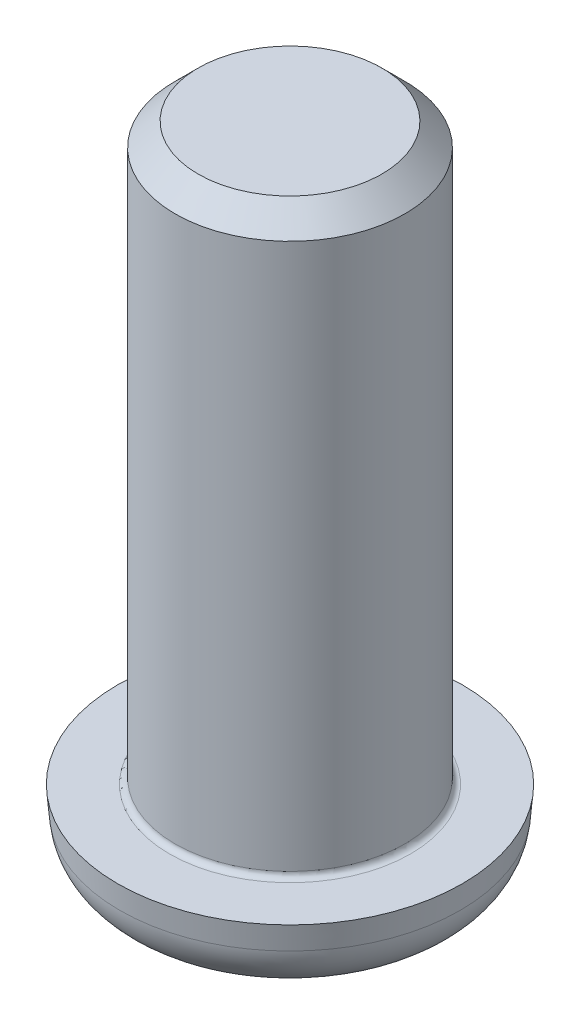
ISO-10303-21;
HEADER;
FILE_DESCRIPTION(('STEP AP214'),'2;1');
FILE_NAME('part.step','',(''),(''),'','','');
FILE_SCHEMA(('AUTOMOTIVE_DESIGN { 1 0 10303 214 1 1 1 1 }'));
ENDSEC;
DATA;
#1=APPLICATION_CONTEXT('core data for automotive mechanical design processes');
#2=APPLICATION_PROTOCOL_DEFINITION('international standard','automotive_design',2000,#1);
#3=PRODUCT_CONTEXT('',#1,'mechanical');
#4=PRODUCT('Part','Part','',(#3));
#5=PRODUCT_RELATED_PRODUCT_CATEGORY('part','',(#4));
#6=PRODUCT_DEFINITION_FORMATION('','',#4);
#7=PRODUCT_DEFINITION_CONTEXT('part definition',#1,'design');
#8=PRODUCT_DEFINITION('design','',#6,#7);
#9=PRODUCT_DEFINITION_SHAPE('','',#8);
#10=(LENGTH_UNIT() NAMED_UNIT(*) SI_UNIT(.MILLI.,.METRE.));
#11=(NAMED_UNIT(*) PLANE_ANGLE_UNIT() SI_UNIT($,.RADIAN.));
#12=(NAMED_UNIT(*) SI_UNIT($,.STERADIAN.) SOLID_ANGLE_UNIT());
#13=UNCERTAINTY_MEASURE_WITH_UNIT(LENGTH_MEASURE(1.E-05),#10,'distance_accuracy_value','');
#14=(GEOMETRIC_REPRESENTATION_CONTEXT(3) GLOBAL_UNCERTAINTY_ASSIGNED_CONTEXT((#13)) GLOBAL_UNIT_ASSIGNED_CONTEXT((#10,
#11,#12)) REPRESENTATION_CONTEXT('',''));
#15=CARTESIAN_POINT('',(0.,0.,0.));
#16=DIRECTION('',(0.,0.,1.));
#17=DIRECTION('',(1.,0.,0.));
#18=AXIS2_PLACEMENT_3D('',#15,#16,#17);
#19=CARTESIAN_POINT('',(0.,0.,1.));
#20=DIRECTION('',(0.,1.,0.));
#21=DIRECTION('',(0.,0.,1.));
#22=AXIS2_PLACEMENT_3D('',#19,#20,#21);
#23=PLANE('',#22);
#24=CARTESIAN_POINT('',(0.,0.,0.));
#25=DIRECTION('',(0.,1.,0.));
#26=DIRECTION('',(0.,0.,1.));
#27=AXIS2_PLACEMENT_3D('',#24,#25,#26);
#28=CIRCLE('',#27,1.05);
#29=CARTESIAN_POINT('',(0.,0.,1.05));
#30=VERTEX_POINT('',#29);
#31=EDGE_CURVE('E286',#30,#30,#28,.F.);
#32=ORIENTED_EDGE('',*,*,#31,.T.);
#33=EDGE_LOOP('',(#32));
#34=FACE_BOUND('',#33,.T.);
#35=CARTESIAN_POINT('',(0.,0.,0.));
#36=DIRECTION('',(0.,1.,0.));
#37=DIRECTION('',(0.,0.,1.));
#38=AXIS2_PLACEMENT_3D('',#35,#36,#37);
#39=CIRCLE('',#38,1.5);
#40=CARTESIAN_POINT('',(0.,0.,1.5));
#41=VERTEX_POINT('',#40);
#42=EDGE_CURVE('E270',#41,#41,#39,.T.);
#43=ORIENTED_EDGE('',*,*,#42,.T.);
#44=EDGE_LOOP('',(#43));
#45=FACE_BOUND('',#44,.T.);
#46=ADVANCED_FACE('F36',(#34,#45),#23,.T.);
#47=CARTESIAN_POINT('',(0.,0.,0.));
#48=DIRECTION('',(0.,1.,0.));
#49=DIRECTION('',(0.,0.,1.));
#50=AXIS2_PLACEMENT_3D('',#47,#48,#49);
#51=CONICAL_SURFACE('',#50,1.5,0.087266462599715);
#52=CARTESIAN_POINT('',(0.,-0.21,0.));
#53=DIRECTION('',(0.,1.,0.));
#54=DIRECTION('',(0.,0.,1.));
#55=AXIS2_PLACEMENT_3D('',#52,#53,#54);
#56=CIRCLE('',#55,1.48162738065956);
#57=CARTESIAN_POINT('',(0.,-0.21,1.48162738065956));
#58=VERTEX_POINT('',#57);
#59=EDGE_CURVE('E196',#58,#58,#56,.T.);
#60=ORIENTED_EDGE('',*,*,#59,.T.);
#61=EDGE_LOOP('',(#60));
#62=FACE_BOUND('',#61,.T.);
#63=ORIENTED_EDGE('',*,*,#42,.F.);
#64=EDGE_LOOP('',(#63));
#65=FACE_BOUND('',#64,.T.);
#66=ADVANCED_FACE('F305',(#62,#65),#51,.T.);
#67=CARTESIAN_POINT('',(0.,-0.169099911978679,0.));
#68=DIRECTION('',(0.,1.,0.));
#69=DIRECTION('',(0.,0.,1.));
#70=AXIS2_PLACEMENT_3D('',#67,#68,#69);
#71=TOROIDAL_SURFACE('',#70,1.01413723538831,0.469275881679299);
#72=CARTESIAN_POINT('',(0.,-0.571497043538653,0.));
#73=DIRECTION('',(0.,1.,0.));
#74=DIRECTION('',(0.,0.,1.));
#75=AXIS2_PLACEMENT_3D('',#72,#73,#74);
#76=CIRCLE('',#75,1.25558371318036);
#77=CARTESIAN_POINT('',(0.,-0.571497043538653,1.25558371318036));
#78=VERTEX_POINT('',#77);
#79=EDGE_CURVE('E274',#78,#78,#76,.T.);
#80=ORIENTED_EDGE('',*,*,#79,.T.);
#81=EDGE_LOOP('',(#80));
#82=FACE_BOUND('',#81,.T.);
#83=ORIENTED_EDGE('',*,*,#59,.F.);
#84=EDGE_LOOP('',(#83));
#85=FACE_BOUND('',#84,.T.);
#86=ADVANCED_FACE('F311',(#82,#85),#71,.T.);
#87=CARTESIAN_POINT('',(0.,-0.6,0.));
#88=DIRECTION('',(0.,-1.,0.));
#89=DIRECTION('',(0.,0.,-1.));
#90=AXIS2_PLACEMENT_3D('',#87,#88,#89);
#91=PLANE('',#90);
#92=DIRECTION('',(0.,0.,-1.));
#93=VECTOR('',#92,1.);
#94=CARTESIAN_POINT('',(-0.15725,-0.6,0.925));
#95=LINE('',#94,#93);
#96=CARTESIAN_POINT('',(-0.15725,-0.6,0.925));
#97=VERTEX_POINT('',#96);
#98=CARTESIAN_POINT('',(-0.15725,-0.6,0.15725));
#99=VERTEX_POINT('',#98);
#100=EDGE_CURVE('E52',#97,#99,#95,.T.);
#101=ORIENTED_EDGE('',*,*,#100,.F.);
#102=DIRECTION('',(-1.,0.,0.));
#103=VECTOR('',#102,1.);
#104=CARTESIAN_POINT('',(-0.15725,-0.6,0.925));
#105=LINE('',#104,#103);
#106=CARTESIAN_POINT('',(0.15725,-0.6,0.925));
#107=VERTEX_POINT('',#106);
#108=EDGE_CURVE('E190',#107,#97,#105,.T.);
#109=ORIENTED_EDGE('',*,*,#108,.F.);
#110=DIRECTION('',(0.,0.,1.));
#111=VECTOR('',#110,1.);
#112=CARTESIAN_POINT('',(0.15725,-0.6,0.925));
#113=LINE('',#112,#111);
#114=CARTESIAN_POINT('',(0.157250000000001,-0.6,0.15725));
#115=VERTEX_POINT('',#114);
#116=EDGE_CURVE('E187',#115,#107,#113,.T.);
#117=ORIENTED_EDGE('',*,*,#116,.F.);
#118=DIRECTION('',(-1.,0.,0.));
#119=VECTOR('',#118,1.);
#120=CARTESIAN_POINT('',(0.157250000000001,-0.6,0.15725));
#121=LINE('',#120,#119);
#122=CARTESIAN_POINT('',(0.925,-0.6,0.15725));
#123=VERTEX_POINT('',#122);
#124=EDGE_CURVE('E183',#123,#115,#121,.T.);
#125=ORIENTED_EDGE('',*,*,#124,.F.);
#126=DIRECTION('',(0.,0.,1.));
#127=VECTOR('',#126,1.);
#128=CARTESIAN_POINT('',(0.925,-0.6,0.15725));
#129=LINE('',#128,#127);
#130=CARTESIAN_POINT('',(0.925,-0.6,-0.15725));
#131=VERTEX_POINT('',#130);
#132=EDGE_CURVE('E179',#131,#123,#129,.T.);
#133=ORIENTED_EDGE('',*,*,#132,.F.);
#134=DIRECTION('',(1.,0.,0.));
#135=VECTOR('',#134,1.);
#136=CARTESIAN_POINT('',(0.157250000000001,-0.6,-0.15725));
#137=LINE('',#136,#135);
#138=CARTESIAN_POINT('',(0.157250000000001,-0.6,-0.15725));
#139=VERTEX_POINT('',#138);
#140=EDGE_CURVE('E175',#139,#131,#137,.T.);
#141=ORIENTED_EDGE('',*,*,#140,.F.);
#142=DIRECTION('',(0.,0.,1.));
#143=VECTOR('',#142,1.);
#144=CARTESIAN_POINT('',(0.157250000000001,-0.6,-0.15725));
#145=LINE('',#144,#143);
#146=CARTESIAN_POINT('',(0.157250000000001,-0.6,-0.925));
#147=VERTEX_POINT('',#146);
#148=EDGE_CURVE('E171',#147,#139,#145,.T.);
#149=ORIENTED_EDGE('',*,*,#148,.F.);
#150=DIRECTION('',(1.,0.,0.));
#151=VECTOR('',#150,1.);
#152=CARTESIAN_POINT('',(-0.15725,-0.6,-0.925));
#153=LINE('',#152,#151);
#154=CARTESIAN_POINT('',(-0.15725,-0.6,-0.925));
#155=VERTEX_POINT('',#154);
#156=EDGE_CURVE('E167',#155,#147,#153,.T.);
#157=ORIENTED_EDGE('',*,*,#156,.F.);
#158=DIRECTION('',(0.,0.,-1.));
#159=VECTOR('',#158,1.);
#160=CARTESIAN_POINT('',(-0.15725,-0.6,-0.15725));
#161=LINE('',#160,#159);
#162=CARTESIAN_POINT('',(-0.15725,-0.6,-0.15725));
#163=VERTEX_POINT('',#162);
#164=EDGE_CURVE('E160',#163,#155,#161,.T.);
#165=ORIENTED_EDGE('',*,*,#164,.F.);
#166=DIRECTION('',(1.,0.,0.));
#167=VECTOR('',#166,1.);
#168=CARTESIAN_POINT('',(-0.925,-0.6,-0.15725));
#169=LINE('',#168,#167);
#170=CARTESIAN_POINT('',(-0.925,-0.6,-0.15725));
#171=VERTEX_POINT('',#170);
#172=EDGE_CURVE('E154',#171,#163,#169,.T.);
#173=ORIENTED_EDGE('',*,*,#172,.F.);
#174=DIRECTION('',(0.,0.,-1.));
#175=VECTOR('',#174,1.);
#176=CARTESIAN_POINT('',(-0.925,-0.6,0.15725));
#177=LINE('',#176,#175);
#178=CARTESIAN_POINT('',(-0.925,-0.6,0.15725));
#179=VERTEX_POINT('',#178);
#180=EDGE_CURVE('E135',#179,#171,#177,.T.);
#181=ORIENTED_EDGE('',*,*,#180,.F.);
#182=DIRECTION('',(-1.,0.,0.));
#183=VECTOR('',#182,1.);
#184=CARTESIAN_POINT('',(-0.925,-0.6,0.15725));
#185=LINE('',#184,#183);
#186=EDGE_CURVE('E145',#99,#179,#185,.T.);
#187=ORIENTED_EDGE('',*,*,#186,.F.);
#188=EDGE_LOOP('',(#101,#109,#117,#125,#133,#141,#149,#157,#165,#173,#181,#187));
#189=FACE_BOUND('',#188,.T.);
#190=CARTESIAN_POINT('',(0.,-0.6,0.));
#191=DIRECTION('',(0.,-1.,0.));
#192=DIRECTION('',(0.,0.,-1.));
#193=AXIS2_PLACEMENT_3D('',#190,#191,#192);
#194=CIRCLE('',#193,1.15268199279872);
#195=CARTESIAN_POINT('',(0.,-0.6,-1.15268199279872));
#196=VERTEX_POINT('',#195);
#197=EDGE_CURVE('E278',#196,#196,#194,.T.);
#198=ORIENTED_EDGE('',*,*,#197,.T.);
#199=EDGE_LOOP('',(#198));
#200=FACE_BOUND('',#199,.T.);
#201=ADVANCED_FACE('F150',(#189,#200),#91,.T.);
#202=CARTESIAN_POINT('',(0.,5.,1.));
#203=DIRECTION('',(0.,1.,0.));
#204=DIRECTION('',(0.,0.,1.));
#205=AXIS2_PLACEMENT_3D('',#202,#203,#204);
#206=PLANE('',#205);
#207=CARTESIAN_POINT('',(0.,5.,0.));
#208=DIRECTION('',(0.,1.,0.));
#209=DIRECTION('',(0.,0.,1.));
#210=AXIS2_PLACEMENT_3D('',#207,#208,#209);
#211=CIRCLE('',#210,0.8);
#212=CARTESIAN_POINT('',(0.,5.,0.8));
#213=VERTEX_POINT('',#212);
#214=EDGE_CURVE('E45',#213,#213,#211,.T.);
#215=ORIENTED_EDGE('',*,*,#214,.T.);
#216=EDGE_LOOP('',(#215));
#217=FACE_BOUND('',#216,.T.);
#218=ADVANCED_FACE('F293',(#217),#206,.T.);
#219=CARTESIAN_POINT('',(0.,5.,0.));
#220=DIRECTION('',(0.,1.,0.));
#221=DIRECTION('',(0.,0.,1.));
#222=AXIS2_PLACEMENT_3D('',#219,#220,#221);
#223=CYLINDRICAL_SURFACE('',#222,1.);
#224=CARTESIAN_POINT('',(0.,4.8,0.));
#225=DIRECTION('',(0.,1.,0.));
#226=DIRECTION('',(0.,0.,1.));
#227=AXIS2_PLACEMENT_3D('',#224,#225,#226);
#228=CIRCLE('',#227,1.);
#229=CARTESIAN_POINT('',(0.,4.8,1.));
#230=VERTEX_POINT('',#229);
#231=EDGE_CURVE('E11',#230,#230,#228,.F.);
#232=ORIENTED_EDGE('',*,*,#231,.T.);
#233=EDGE_LOOP('',(#232));
#234=FACE_BOUND('',#233,.T.);
#235=CARTESIAN_POINT('',(0.,0.0499999999999997,0.));
#236=DIRECTION('',(0.,1.,0.));
#237=DIRECTION('',(0.,0.,1.));
#238=AXIS2_PLACEMENT_3D('',#235,#236,#237);
#239=CIRCLE('',#238,1.);
#240=CARTESIAN_POINT('',(0.,0.0499999999999996,1.));
#241=VERTEX_POINT('',#240);
#242=EDGE_CURVE('E282',#241,#241,#239,.T.);
#243=ORIENTED_EDGE('',*,*,#242,.T.);
#244=EDGE_LOOP('',(#243));
#245=FACE_BOUND('',#244,.T.);
#246=ADVANCED_FACE('F320',(#234,#245),#223,.T.);
#247=CARTESIAN_POINT('',(0.,-0.4,0.));
#248=DIRECTION('',(0.,-1.,0.));
#249=DIRECTION('',(0.,0.,-1.));
#250=AXIS2_PLACEMENT_3D('',#247,#248,#249);
#251=TOROIDAL_SURFACE('',#250,1.15268199279872,0.2);
#252=ORIENTED_EDGE('',*,*,#197,.F.);
#253=EDGE_LOOP('',(#252));
#254=FACE_BOUND('',#253,.T.);
#255=ORIENTED_EDGE('',*,*,#79,.F.);
#256=EDGE_LOOP('',(#255));
#257=FACE_BOUND('',#256,.T.);
#258=ADVANCED_FACE('F317',(#254,#257),#251,.T.);
#259=CARTESIAN_POINT('',(-0.15725,-0.6,0.925));
#260=DIRECTION('',(-0.998629534754574,0.0523359562429439,0.));
#261=DIRECTION('',(-0.052335956242944,-0.998629534754574,0.));
#262=AXIS2_PLACEMENT_3D('',#259,#260,#261);
#263=PLANE('',#262);
#264=ORIENTED_EDGE('',*,*,#100,.T.);
#265=DIRECTION('',(-0.052264427688714,-0.997264688634237,0.0522644276887139));
#266=VECTOR('',#265,1.);
#267=CARTESIAN_POINT('',(-0.159347163175851,-0.640016257214874,0.15934716317585));
#268=LINE('',#267,#266);
#269=CARTESIAN_POINT('',(-0.090692120310538,0.67,0.0906921203105376));
#270=VERTEX_POINT('',#269);
#271=EDGE_CURVE('E95',#270,#99,#268,.T.);
#272=ORIENTED_EDGE('',*,*,#271,.F.);
#273=DIRECTION('',(0.,0.,-1.));
#274=VECTOR('',#273,1.);
#275=CARTESIAN_POINT('',(-0.090692120310538,0.67,-0.15725));
#276=LINE('',#275,#274);
#277=CARTESIAN_POINT('',(-0.0906921203105379,0.67,0.858442120310538));
#278=VERTEX_POINT('',#277);
#279=EDGE_CURVE('E193',#278,#270,#276,.T.);
#280=ORIENTED_EDGE('',*,*,#279,.F.);
#281=DIRECTION('',(-0.052264427688714,-0.997264688634237,0.0522644276887139));
#282=VECTOR('',#281,1.);
#283=CARTESIAN_POINT('',(-0.15725,-0.6,0.925));
#284=LINE('',#283,#282);
#285=EDGE_CURVE('E60',#278,#97,#284,.T.);
#286=ORIENTED_EDGE('',*,*,#285,.T.);
#287=EDGE_LOOP('',(#264,#272,#280,#286));
#288=FACE_BOUND('',#287,.T.);
#289=ADVANCED_FACE('F319',(#288),#263,.F.);
#290=CARTESIAN_POINT('',(-0.15725,-0.6,0.925));
#291=DIRECTION('',(0.,0.0523359562429438,0.998629534754574));
#292=DIRECTION('',(0.,-0.998629534754574,0.0523359562429438));
#293=AXIS2_PLACEMENT_3D('',#290,#291,#292);
#294=PLANE('',#293);
#295=ORIENTED_EDGE('',*,*,#108,.T.);
#296=ORIENTED_EDGE('',*,*,#285,.F.);
#297=DIRECTION('',(-1.,0.,0.));
#298=VECTOR('',#297,1.);
#299=CARTESIAN_POINT('',(-0.15725,0.67,0.858442120310538));
#300=LINE('',#299,#298);
#301=CARTESIAN_POINT('',(0.0906921203105374,0.67,0.858442120310538));
#302=VERTEX_POINT('',#301);
#303=EDGE_CURVE('E198',#302,#278,#300,.T.);
#304=ORIENTED_EDGE('',*,*,#303,.F.);
#305=DIRECTION('',(0.052264427688714,-0.997264688634237,0.0522644276887139));
#306=VECTOR('',#305,1.);
#307=CARTESIAN_POINT('',(0.15725,-0.6,0.925));
#308=LINE('',#307,#306);
#309=EDGE_CURVE('E100',#302,#107,#308,.T.);
#310=ORIENTED_EDGE('',*,*,#309,.T.);
#311=EDGE_LOOP('',(#295,#296,#304,#310));
#312=FACE_BOUND('',#311,.T.);
#313=ADVANCED_FACE('F326',(#312),#294,.F.);
#314=CARTESIAN_POINT('',(0.15725,-0.6,0.925));
#315=DIRECTION('',(0.998629534754574,0.0523359562429439,0.));
#316=DIRECTION('',(-0.052335956242944,0.998629534754574,0.));
#317=AXIS2_PLACEMENT_3D('',#314,#315,#316);
#318=PLANE('',#317);
#319=ORIENTED_EDGE('',*,*,#116,.T.);
#320=ORIENTED_EDGE('',*,*,#309,.F.);
#321=DIRECTION('',(0.,0.,1.));
#322=VECTOR('',#321,1.);
#323=CARTESIAN_POINT('',(0.090692120310539,0.67,-0.15725));
#324=LINE('',#323,#322);
#325=CARTESIAN_POINT('',(0.0906921203105386,0.67,0.0906921203105376));
#326=VERTEX_POINT('',#325);
#327=EDGE_CURVE('E232',#326,#302,#324,.T.);
#328=ORIENTED_EDGE('',*,*,#327,.F.);
#329=DIRECTION('',(0.052264427688714,-0.997264688634237,0.0522644276887139));
#330=VECTOR('',#329,1.);
#331=CARTESIAN_POINT('',(0.159347163175851,-0.640016257214874,0.15934716317585));
#332=LINE('',#331,#330);
#333=EDGE_CURVE('E220',#326,#115,#332,.T.);
#334=ORIENTED_EDGE('',*,*,#333,.T.);
#335=EDGE_LOOP('',(#319,#320,#328,#334));
#336=FACE_BOUND('',#335,.T.);
#337=ADVANCED_FACE('F348',(#336),#318,.F.);
#338=CARTESIAN_POINT('',(0.157250000000001,-0.6,0.15725));
#339=DIRECTION('',(0.,0.0523359562429438,0.998629534754574));
#340=DIRECTION('',(0.,-0.998629534754574,0.0523359562429438));
#341=AXIS2_PLACEMENT_3D('',#338,#339,#340);
#342=PLANE('',#341);
#343=ORIENTED_EDGE('',*,*,#124,.T.);
#344=ORIENTED_EDGE('',*,*,#333,.F.);
#345=DIRECTION('',(-1.,0.,0.));
#346=VECTOR('',#345,1.);
#347=CARTESIAN_POINT('',(-0.15725,0.67,0.0906921203105376));
#348=LINE('',#347,#346);
#349=CARTESIAN_POINT('',(0.858442120310538,0.67,0.0906921203105376));
#350=VERTEX_POINT('',#349);
#351=EDGE_CURVE('E236',#350,#326,#348,.T.);
#352=ORIENTED_EDGE('',*,*,#351,.F.);
#353=DIRECTION('',(0.052264427688714,-0.997264688634237,0.0522644276887139));
#354=VECTOR('',#353,1.);
#355=CARTESIAN_POINT('',(0.925,-0.6,0.15725));
#356=LINE('',#355,#354);
#357=EDGE_CURVE('E217',#350,#123,#356,.T.);
#358=ORIENTED_EDGE('',*,*,#357,.T.);
#359=EDGE_LOOP('',(#343,#344,#352,#358));
#360=FACE_BOUND('',#359,.T.);
#361=ADVANCED_FACE('F351',(#360),#342,.F.);
#362=CARTESIAN_POINT('',(0.925,-0.6,0.15725));
#363=DIRECTION('',(0.998629534754574,0.0523359562429439,0.));
#364=DIRECTION('',(-0.052335956242944,0.998629534754574,0.));
#365=AXIS2_PLACEMENT_3D('',#362,#363,#364);
#366=PLANE('',#365);
#367=ORIENTED_EDGE('',*,*,#132,.T.);
#368=ORIENTED_EDGE('',*,*,#357,.F.);
#369=DIRECTION('',(0.,0.,1.));
#370=VECTOR('',#369,1.);
#371=CARTESIAN_POINT('',(0.858442120310538,0.67,-0.15725));
#372=LINE('',#371,#370);
#373=CARTESIAN_POINT('',(0.858442120310538,0.67,-0.0906921203105375));
#374=VERTEX_POINT('',#373);
#375=EDGE_CURVE('E240',#374,#350,#372,.T.);
#376=ORIENTED_EDGE('',*,*,#375,.F.);
#377=DIRECTION('',(0.052264427688714,-0.997264688634237,-0.0522644276887142));
#378=VECTOR('',#377,1.);
#379=CARTESIAN_POINT('',(0.92290283682415,-0.559983742785126,-0.15515283682415));
#380=LINE('',#379,#378);
#381=EDGE_CURVE('E214',#374,#131,#380,.T.);
#382=ORIENTED_EDGE('',*,*,#381,.T.);
#383=EDGE_LOOP('',(#367,#368,#376,#382));
#384=FACE_BOUND('',#383,.T.);
#385=ADVANCED_FACE('F355',(#384),#366,.F.);
#386=CARTESIAN_POINT('',(0.157250000000001,-0.6,-0.15725));
#387=DIRECTION('',(0.,0.0523359562429441,-0.998629534754574));
#388=DIRECTION('',(0.,0.998629534754574,0.0523359562429441));
#389=AXIS2_PLACEMENT_3D('',#386,#387,#388);
#390=PLANE('',#389);
#391=ORIENTED_EDGE('',*,*,#140,.T.);
#392=ORIENTED_EDGE('',*,*,#381,.F.);
#393=DIRECTION('',(1.,0.,0.));
#394=VECTOR('',#393,1.);
#395=CARTESIAN_POINT('',(-0.15725,0.67,-0.0906921203105374));
#396=LINE('',#395,#394);
#397=CARTESIAN_POINT('',(0.0906921203105385,0.67,-0.0906921203105374));
#398=VERTEX_POINT('',#397);
#399=EDGE_CURVE('E244',#398,#374,#396,.T.);
#400=ORIENTED_EDGE('',*,*,#399,.F.);
#401=DIRECTION('',(0.0522644276887141,-0.997264688634237,-0.0522644276887142));
#402=VECTOR('',#401,1.);
#403=CARTESIAN_POINT('',(0.157250000000001,-0.6,-0.15725));
#404=LINE('',#403,#402);
#405=EDGE_CURVE('E211',#398,#139,#404,.T.);
#406=ORIENTED_EDGE('',*,*,#405,.T.);
#407=EDGE_LOOP('',(#391,#392,#400,#406));
#408=FACE_BOUND('',#407,.T.);
#409=ADVANCED_FACE('F359',(#408),#390,.F.);
#410=CARTESIAN_POINT('',(0.157250000000001,-0.6,-0.15725));
#411=DIRECTION('',(0.998629534754574,0.0523359562429439,0.));
#412=DIRECTION('',(-0.052335956242944,0.998629534754574,0.));
#413=AXIS2_PLACEMENT_3D('',#410,#411,#412);
#414=PLANE('',#413);
#415=ORIENTED_EDGE('',*,*,#148,.T.);
#416=ORIENTED_EDGE('',*,*,#405,.F.);
#417=DIRECTION('',(0.,0.,1.));
#418=VECTOR('',#417,1.);
#419=CARTESIAN_POINT('',(0.0906921203105385,0.67,-0.15725));
#420=LINE('',#419,#418);
#421=CARTESIAN_POINT('',(0.0906921203105386,0.67,-0.858442120310538));
#422=VERTEX_POINT('',#421);
#423=EDGE_CURVE('E248',#422,#398,#420,.T.);
#424=ORIENTED_EDGE('',*,*,#423,.F.);
#425=DIRECTION('',(0.0522644276887141,-0.997264688634237,-0.0522644276887142));
#426=VECTOR('',#425,1.);
#427=CARTESIAN_POINT('',(0.156390921108689,-0.583607798249329,-0.924140921108688));
#428=LINE('',#427,#426);
#429=EDGE_CURVE('E208',#422,#147,#428,.T.);
#430=ORIENTED_EDGE('',*,*,#429,.T.);
#431=EDGE_LOOP('',(#415,#416,#424,#430));
#432=FACE_BOUND('',#431,.T.);
#433=ADVANCED_FACE('F363',(#432),#414,.F.);
#434=CARTESIAN_POINT('',(-0.15725,-0.6,-0.925));
#435=DIRECTION('',(0.,0.0523359562429441,-0.998629534754574));
#436=DIRECTION('',(0.,0.998629534754574,0.0523359562429441));
#437=AXIS2_PLACEMENT_3D('',#434,#435,#436);
#438=PLANE('',#437);
#439=ORIENTED_EDGE('',*,*,#156,.T.);
#440=ORIENTED_EDGE('',*,*,#429,.F.);
#441=DIRECTION('',(1.,0.,0.));
#442=VECTOR('',#441,1.);
#443=CARTESIAN_POINT('',(-0.15725,0.67,-0.858442120310538));
#444=LINE('',#443,#442);
#445=CARTESIAN_POINT('',(-0.0906921203105378,0.67,-0.858442120310538));
#446=VERTEX_POINT('',#445);
#447=EDGE_CURVE('E252',#446,#422,#444,.T.);
#448=ORIENTED_EDGE('',*,*,#447,.F.);
#449=DIRECTION('',(-0.052264427688714,-0.997264688634237,-0.0522644276887142));
#450=VECTOR('',#449,1.);
#451=CARTESIAN_POINT('',(-0.15515283682415,-0.559983742785126,-0.92290283682415));
#452=LINE('',#451,#450);
#453=EDGE_CURVE('E205',#446,#155,#452,.T.);
#454=ORIENTED_EDGE('',*,*,#453,.T.);
#455=EDGE_LOOP('',(#439,#440,#448,#454));
#456=FACE_BOUND('',#455,.T.);
#457=ADVANCED_FACE('F367',(#456),#438,.F.);
#458=CARTESIAN_POINT('',(-0.15725,-0.6,-0.15725));
#459=DIRECTION('',(-0.998629534754574,0.0523359562429439,0.));
#460=DIRECTION('',(-0.052335956242944,-0.998629534754574,0.));
#461=AXIS2_PLACEMENT_3D('',#458,#459,#460);
#462=PLANE('',#461);
#463=ORIENTED_EDGE('',*,*,#164,.T.);
#464=ORIENTED_EDGE('',*,*,#453,.F.);
#465=DIRECTION('',(0.,0.,-1.));
#466=VECTOR('',#465,1.);
#467=CARTESIAN_POINT('',(-0.0906921203105379,0.67,-0.15725));
#468=LINE('',#467,#466);
#469=CARTESIAN_POINT('',(-0.0906921203105379,0.67,-0.0906921203105375));
#470=VERTEX_POINT('',#469);
#471=EDGE_CURVE('E256',#470,#446,#468,.T.);
#472=ORIENTED_EDGE('',*,*,#471,.F.);
#473=DIRECTION('',(-0.052264427688714,-0.997264688634237,-0.0522644276887142));
#474=VECTOR('',#473,1.);
#475=CARTESIAN_POINT('',(-0.15725,-0.6,-0.15725));
#476=LINE('',#475,#474);
#477=EDGE_CURVE('E202',#470,#163,#476,.T.);
#478=ORIENTED_EDGE('',*,*,#477,.T.);
#479=EDGE_LOOP('',(#463,#464,#472,#478));
#480=FACE_BOUND('',#479,.T.);
#481=ADVANCED_FACE('F371',(#480),#462,.F.);
#482=CARTESIAN_POINT('',(-0.925,-0.6,-0.15725));
#483=DIRECTION('',(0.,0.0523359562429441,-0.998629534754574));
#484=DIRECTION('',(0.,0.998629534754574,0.0523359562429441));
#485=AXIS2_PLACEMENT_3D('',#482,#483,#484);
#486=PLANE('',#485);
#487=ORIENTED_EDGE('',*,*,#172,.T.);
#488=ORIENTED_EDGE('',*,*,#477,.F.);
#489=DIRECTION('',(1.,0.,0.));
#490=VECTOR('',#489,1.);
#491=CARTESIAN_POINT('',(-0.15725,0.67,-0.0906921203105375));
#492=LINE('',#491,#490);
#493=CARTESIAN_POINT('',(-0.858442120310538,0.67,-0.0906921203105376));
#494=VERTEX_POINT('',#493);
#495=EDGE_CURVE('E260',#494,#470,#492,.T.);
#496=ORIENTED_EDGE('',*,*,#495,.F.);
#497=DIRECTION('',(-0.0522644276887141,-0.997264688634237,-0.0522644276887142));
#498=VECTOR('',#497,1.);
#499=CARTESIAN_POINT('',(-0.924140921108688,-0.583607798249329,-0.156390921108688));
#500=LINE('',#499,#498);
#501=EDGE_CURVE('E142',#494,#171,#500,.T.);
#502=ORIENTED_EDGE('',*,*,#501,.T.);
#503=EDGE_LOOP('',(#487,#488,#496,#502));
#504=FACE_BOUND('',#503,.T.);
#505=ADVANCED_FACE('F375',(#504),#486,.F.);
#506=CARTESIAN_POINT('',(-0.925,-0.6,0.15725));
#507=DIRECTION('',(-0.998629534754574,0.0523359562429439,0.));
#508=DIRECTION('',(-0.052335956242944,-0.998629534754574,0.));
#509=AXIS2_PLACEMENT_3D('',#506,#507,#508);
#510=PLANE('',#509);
#511=ORIENTED_EDGE('',*,*,#180,.T.);
#512=ORIENTED_EDGE('',*,*,#501,.F.);
#513=DIRECTION('',(0.,0.,-1.));
#514=VECTOR('',#513,1.);
#515=CARTESIAN_POINT('',(-0.858442120310538,0.67,-0.157249999999999));
#516=LINE('',#515,#514);
#517=CARTESIAN_POINT('',(-0.858442120310537,0.67,0.0906921203105374));
#518=VERTEX_POINT('',#517);
#519=EDGE_CURVE('E138',#518,#494,#516,.T.);
#520=ORIENTED_EDGE('',*,*,#519,.F.);
#521=DIRECTION('',(-0.052264427688714,-0.997264688634237,0.0522644276887139));
#522=VECTOR('',#521,1.);
#523=CARTESIAN_POINT('',(-0.925,-0.6,0.15725));
#524=LINE('',#523,#522);
#525=EDGE_CURVE('E131',#518,#179,#524,.T.);
#526=ORIENTED_EDGE('',*,*,#525,.T.);
#527=EDGE_LOOP('',(#511,#512,#520,#526));
#528=FACE_BOUND('',#527,.T.);
#529=ADVANCED_FACE('F133',(#528),#510,.F.);
#530=CARTESIAN_POINT('',(-0.925,-0.6,0.15725));
#531=DIRECTION('',(0.,0.0523359562429438,0.998629534754574));
#532=DIRECTION('',(0.,-0.998629534754574,0.0523359562429438));
#533=AXIS2_PLACEMENT_3D('',#530,#531,#532);
#534=PLANE('',#533);
#535=ORIENTED_EDGE('',*,*,#186,.T.);
#536=ORIENTED_EDGE('',*,*,#525,.F.);
#537=DIRECTION('',(-1.,0.,0.));
#538=VECTOR('',#537,1.);
#539=CARTESIAN_POINT('',(-0.15725,0.67,0.0906921203105376));
#540=LINE('',#539,#538);
#541=EDGE_CURVE('E228',#270,#518,#540,.T.);
#542=ORIENTED_EDGE('',*,*,#541,.F.);
#543=ORIENTED_EDGE('',*,*,#271,.T.);
#544=EDGE_LOOP('',(#535,#536,#542,#543));
#545=FACE_BOUND('',#544,.T.);
#546=ADVANCED_FACE('F146',(#545),#534,.F.);
#547=CARTESIAN_POINT('',(-0.15725,0.67,-0.15725));
#548=DIRECTION('',(0.,-1.,0.));
#549=DIRECTION('',(0.,0.,-1.));
#550=AXIS2_PLACEMENT_3D('',#547,#548,#549);
#551=PLANE('',#550);
#552=ORIENTED_EDGE('',*,*,#279,.T.);
#553=ORIENTED_EDGE('',*,*,#541,.T.);
#554=ORIENTED_EDGE('',*,*,#519,.T.);
#555=ORIENTED_EDGE('',*,*,#495,.T.);
#556=ORIENTED_EDGE('',*,*,#471,.T.);
#557=ORIENTED_EDGE('',*,*,#447,.T.);
#558=ORIENTED_EDGE('',*,*,#423,.T.);
#559=ORIENTED_EDGE('',*,*,#399,.T.);
#560=ORIENTED_EDGE('',*,*,#375,.T.);
#561=ORIENTED_EDGE('',*,*,#351,.T.);
#562=ORIENTED_EDGE('',*,*,#327,.T.);
#563=ORIENTED_EDGE('',*,*,#303,.T.);
#564=EDGE_LOOP('',(#552,#553,#554,#555,#556,#557,#558,#559,#560,#561,#562,#563));
#565=FACE_BOUND('',#564,.T.);
#566=ADVANCED_FACE('F301',(#565),#551,.T.);
#567=CARTESIAN_POINT('',(0.,0.0499999999999997,0.));
#568=DIRECTION('',(0.,1.,0.));
#569=DIRECTION('',(0.,0.,1.));
#570=AXIS2_PLACEMENT_3D('',#567,#568,#569);
#571=TOROIDAL_SURFACE('',#570,1.05,0.05);
#572=ORIENTED_EDGE('',*,*,#31,.F.);
#573=EDGE_LOOP('',(#572));
#574=FACE_BOUND('',#573,.T.);
#575=ORIENTED_EDGE('',*,*,#242,.F.);
#576=EDGE_LOOP('',(#575));
#577=FACE_BOUND('',#576,.T.);
#578=ADVANCED_FACE('F296',(#574,#577),#571,.F.);
#579=CARTESIAN_POINT('',(0.,5.,0.));
#580=DIRECTION('',(0.,-1.,0.));
#581=DIRECTION('',(0.,0.,-1.));
#582=AXIS2_PLACEMENT_3D('',#579,#580,#581);
#583=CONICAL_SURFACE('',#582,0.8,0.785398163397447);
#584=ORIENTED_EDGE('',*,*,#231,.F.);
#585=EDGE_LOOP('',(#584));
#586=FACE_BOUND('',#585,.T.);
#587=ORIENTED_EDGE('',*,*,#214,.F.);
#588=EDGE_LOOP('',(#587));
#589=FACE_BOUND('',#588,.T.);
#590=ADVANCED_FACE('F38',(#586,#589),#583,.T.);
#591=CLOSED_SHELL('',(#46,#66,#86,#201,#218,#246,#258,#289,#313,#337,#361,#385,#409,#433,#457,
#481,#505,#529,#546,#566,#578,#590));
#592=MANIFOLD_SOLID_BREP('B2',#591);
#593=ADVANCED_BREP_SHAPE_REPRESENTATION('',(#18,#592),#14);
#594=SHAPE_DEFINITION_REPRESENTATION(#9,#593);
ENDSEC;
END-ISO-10303-21;
